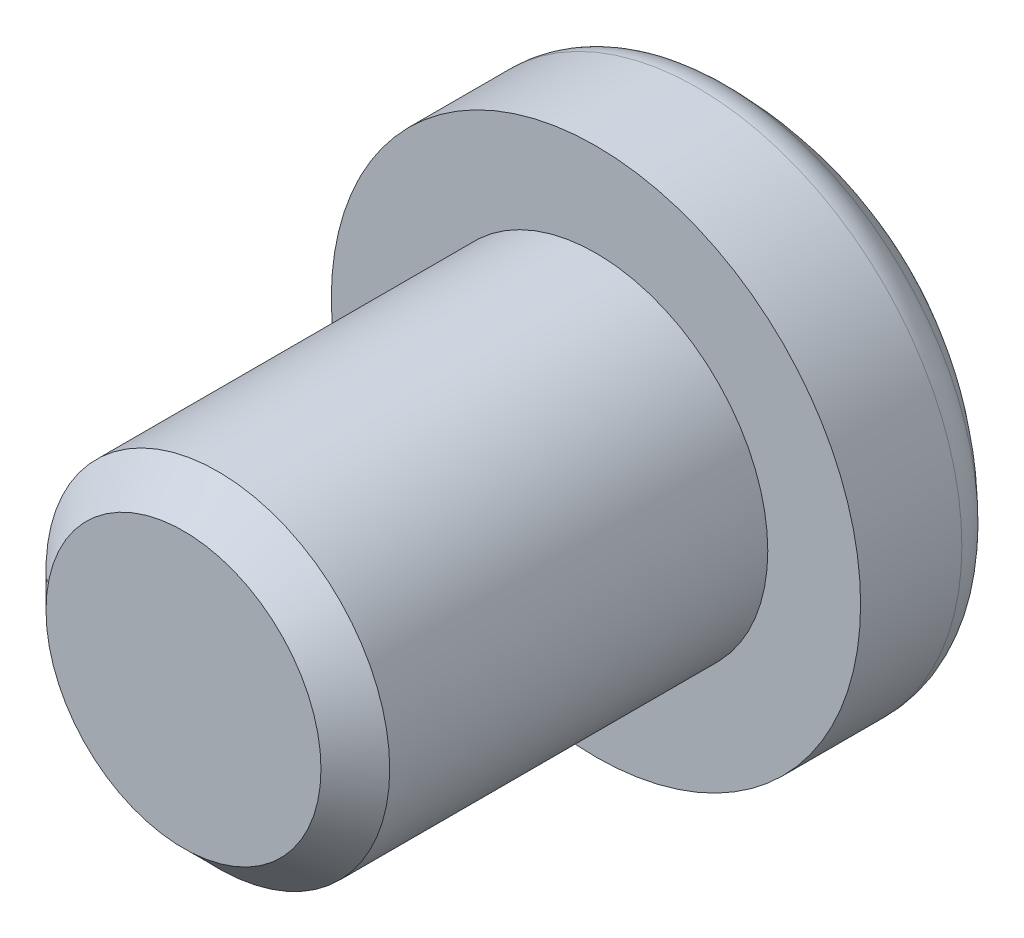
ISO-10303-21;
HEADER;
FILE_DESCRIPTION(('STEP AP214'),'2;1');
FILE_NAME('part.step','',(''),(''),'','','');
FILE_SCHEMA(('AUTOMOTIVE_DESIGN { 1 0 10303 214 1 1 1 1 }'));
ENDSEC;
DATA;
#1=APPLICATION_CONTEXT('core data for automotive mechanical design processes');
#2=APPLICATION_PROTOCOL_DEFINITION('international standard','automotive_design',2000,#1);
#3=PRODUCT_CONTEXT('',#1,'mechanical');
#4=PRODUCT('Part','Part','',(#3));
#5=PRODUCT_RELATED_PRODUCT_CATEGORY('part','',(#4));
#6=PRODUCT_DEFINITION_FORMATION('','',#4);
#7=PRODUCT_DEFINITION_CONTEXT('part definition',#1,'design');
#8=PRODUCT_DEFINITION('design','',#6,#7);
#9=PRODUCT_DEFINITION_SHAPE('','',#8);
#10=(LENGTH_UNIT() NAMED_UNIT(*) SI_UNIT(.MILLI.,.METRE.));
#11=(NAMED_UNIT(*) PLANE_ANGLE_UNIT() SI_UNIT($,.RADIAN.));
#12=(NAMED_UNIT(*) SI_UNIT($,.STERADIAN.) SOLID_ANGLE_UNIT());
#13=UNCERTAINTY_MEASURE_WITH_UNIT(LENGTH_MEASURE(1.E-05),#10,'distance_accuracy_value','');
#14=(GEOMETRIC_REPRESENTATION_CONTEXT(3) GLOBAL_UNCERTAINTY_ASSIGNED_CONTEXT((#13)) GLOBAL_UNIT_ASSIGNED_CONTEXT((#10,
#11,#12)) REPRESENTATION_CONTEXT('',''));
#15=CARTESIAN_POINT('',(0.,0.,0.));
#16=DIRECTION('',(0.,0.,1.));
#17=DIRECTION('',(1.,0.,0.));
#18=AXIS2_PLACEMENT_3D('',#15,#16,#17);
#19=CARTESIAN_POINT('',(0.,0.,1.80955882352941));
#20=DIRECTION('',(0.,0.,-1.));
#21=DIRECTION('',(1.,0.,0.));
#22=AXIS2_PLACEMENT_3D('',#19,#20,#21);
#23=SPHERICAL_SURFACE('',#22,5.20955882352941);
#24=CARTESIAN_POINT('',(0.,0.,-1.87380453128501));
#25=DIRECTION('',(0.,0.,-1.));
#26=DIRECTION('',(-1.,0.,0.));
#27=AXIS2_PLACEMENT_3D('',#24,#25,#26);
#28=CIRCLE('',#27,3.68406535395661);
#29=CARTESIAN_POINT('',(-3.68406535395661,0.,-1.87380453128501));
#30=VERTEX_POINT('',#29);
#31=EDGE_CURVE('E211',#30,#30,#28,.T.);
#32=ORIENTED_EDGE('',*,*,#31,.T.);
#33=EDGE_LOOP('',(#32));
#34=FACE_BOUND('',#33,.T.);
#35=CARTESIAN_POINT('',(-2.35,0.,1.80955882352941));
#36=DIRECTION('',(1.,0.,0.));
#37=DIRECTION('',(0.,0.,-1.));
#38=AXIS2_PLACEMENT_3D('',#35,#36,#37);
#39=CIRCLE('',#38,4.64940890176516);
#40=CARTESIAN_POINT('',(-2.35,-0.6,-2.80097293927335));
#41=VERTEX_POINT('',#40);
#42=CARTESIAN_POINT('',(-2.35,0.6,-2.80097293927335));
#43=VERTEX_POINT('',#42);
#44=EDGE_CURVE('E235',#41,#43,#39,.T.);
#45=ORIENTED_EDGE('',*,*,#44,.F.);
#46=CARTESIAN_POINT('',(0.,-0.6,1.80955882352941));
#47=DIRECTION('',(0.,1.,0.));
#48=DIRECTION('',(-1.,0.,0.));
#49=AXIS2_PLACEMENT_3D('',#46,#47,#48);
#50=CIRCLE('',#49,5.17489160618975);
#51=CARTESIAN_POINT('',(-0.6,-0.6,-3.33043175387568));
#52=VERTEX_POINT('',#51);
#53=EDGE_CURVE('E60',#52,#41,#50,.T.);
#54=ORIENTED_EDGE('',*,*,#53,.F.);
#55=CARTESIAN_POINT('',(-0.6,0.,1.80955882352941));
#56=DIRECTION('',(1.,0.,0.));
#57=DIRECTION('',(0.,1.,0.));
#58=AXIS2_PLACEMENT_3D('',#55,#56,#57);
#59=CIRCLE('',#58,5.17489160618975);
#60=CARTESIAN_POINT('',(-0.6,-2.35,-2.80097293927335));
#61=VERTEX_POINT('',#60);
#62=EDGE_CURVE('E232',#61,#52,#59,.T.);
#63=ORIENTED_EDGE('',*,*,#62,.F.);
#64=CARTESIAN_POINT('',(0.,-2.35,1.80955882352941));
#65=DIRECTION('',(0.,1.,0.));
#66=DIRECTION('',(0.,0.,1.));
#67=AXIS2_PLACEMENT_3D('',#64,#65,#66);
#68=CIRCLE('',#67,4.64940890176516);
#69=CARTESIAN_POINT('',(0.6,-2.35,-2.80097293927335));
#70=VERTEX_POINT('',#69);
#71=EDGE_CURVE('E230',#70,#61,#68,.T.);
#72=ORIENTED_EDGE('',*,*,#71,.F.);
#73=CARTESIAN_POINT('',(0.6,0.,1.80955882352941));
#74=DIRECTION('',(-1.,0.,0.));
#75=DIRECTION('',(0.,-1.,0.));
#76=AXIS2_PLACEMENT_3D('',#73,#74,#75);
#77=CIRCLE('',#76,5.17489160618975);
#78=CARTESIAN_POINT('',(0.6,-0.6,-3.33043175387568));
#79=VERTEX_POINT('',#78);
#80=EDGE_CURVE('E228',#79,#70,#77,.T.);
#81=ORIENTED_EDGE('',*,*,#80,.F.);
#82=CARTESIAN_POINT('',(0.,-0.6,1.80955882352941));
#83=DIRECTION('',(0.,1.,0.));
#84=DIRECTION('',(-1.,0.,0.));
#85=AXIS2_PLACEMENT_3D('',#82,#83,#84);
#86=CIRCLE('',#85,5.17489160618975);
#87=CARTESIAN_POINT('',(2.35,-0.6,-2.80097293927335));
#88=VERTEX_POINT('',#87);
#89=EDGE_CURVE('E226',#88,#79,#86,.T.);
#90=ORIENTED_EDGE('',*,*,#89,.F.);
#91=CARTESIAN_POINT('',(2.35,0.,1.80955882352941));
#92=DIRECTION('',(-1.,0.,0.));
#93=DIRECTION('',(0.,-1.,0.));
#94=AXIS2_PLACEMENT_3D('',#91,#92,#93);
#95=CIRCLE('',#94,4.64940890176516);
#96=CARTESIAN_POINT('',(2.35,0.6,-2.80097293927335));
#97=VERTEX_POINT('',#96);
#98=EDGE_CURVE('E224',#97,#88,#95,.T.);
#99=ORIENTED_EDGE('',*,*,#98,.F.);
#100=CARTESIAN_POINT('',(0.,0.6,1.80955882352941));
#101=DIRECTION('',(0.,-1.,0.));
#102=DIRECTION('',(1.,0.,0.));
#103=AXIS2_PLACEMENT_3D('',#100,#101,#102);
#104=CIRCLE('',#103,5.17489160618975);
#105=CARTESIAN_POINT('',(0.6,0.6,-3.33043175387568));
#106=VERTEX_POINT('',#105);
#107=EDGE_CURVE('E222',#106,#97,#104,.T.);
#108=ORIENTED_EDGE('',*,*,#107,.F.);
#109=CARTESIAN_POINT('',(0.6,0.,1.80955882352941));
#110=DIRECTION('',(-1.,0.,0.));
#111=DIRECTION('',(0.,-1.,0.));
#112=AXIS2_PLACEMENT_3D('',#109,#110,#111);
#113=CIRCLE('',#112,5.17489160618975);
#114=CARTESIAN_POINT('',(0.6,2.35,-2.80097293927335));
#115=VERTEX_POINT('',#114);
#116=EDGE_CURVE('E220',#115,#106,#113,.T.);
#117=ORIENTED_EDGE('',*,*,#116,.F.);
#118=CARTESIAN_POINT('',(0.,2.35,1.80955882352941));
#119=DIRECTION('',(0.,-1.,0.));
#120=DIRECTION('',(0.,0.,-1.));
#121=AXIS2_PLACEMENT_3D('',#118,#119,#120);
#122=CIRCLE('',#121,4.64940890176516);
#123=CARTESIAN_POINT('',(-0.6,2.35,-2.80097293927335));
#124=VERTEX_POINT('',#123);
#125=EDGE_CURVE('E218',#124,#115,#122,.T.);
#126=ORIENTED_EDGE('',*,*,#125,.F.);
#127=CARTESIAN_POINT('',(-0.6,0.,1.80955882352941));
#128=DIRECTION('',(1.,0.,0.));
#129=DIRECTION('',(0.,1.,0.));
#130=AXIS2_PLACEMENT_3D('',#127,#128,#129);
#131=CIRCLE('',#130,5.17489160618975);
#132=CARTESIAN_POINT('',(-0.6,0.6,-3.33043175387568));
#133=VERTEX_POINT('',#132);
#134=EDGE_CURVE('E216',#133,#124,#131,.T.);
#135=ORIENTED_EDGE('',*,*,#134,.F.);
#136=CARTESIAN_POINT('',(0.,0.6,1.80955882352941));
#137=DIRECTION('',(0.,-1.,0.));
#138=DIRECTION('',(1.,0.,0.));
#139=AXIS2_PLACEMENT_3D('',#136,#137,#138);
#140=CIRCLE('',#139,5.17489160618975);
#141=EDGE_CURVE('E214',#43,#133,#140,.T.);
#142=ORIENTED_EDGE('',*,*,#141,.F.);
#143=EDGE_LOOP('',(#45,#54,#63,#72,#81,#90,#99,#108,#117,#126,#135,#142));
#144=FACE_BOUND('',#143,.T.);
#145=ADVANCED_FACE('F37',(#34,#144),#23,.T.);
#146=CARTESIAN_POINT('',(0.,0.,-1.47314887020145));
#147=DIRECTION('',(0.,0.,-1.));
#148=DIRECTION('',(-1.,0.,0.));
#149=AXIS2_PLACEMENT_3D('',#146,#147,#148);
#150=TOROIDAL_SURFACE('',#149,3.28333333333333,0.566666666666667);
#151=ORIENTED_EDGE('',*,*,#31,.F.);
#152=EDGE_LOOP('',(#151));
#153=FACE_BOUND('',#152,.T.);
#154=CARTESIAN_POINT('',(0.,0.,-1.47314887020145));
#155=DIRECTION('',(0.,0.,-1.));
#156=DIRECTION('',(-1.,0.,0.));
#157=AXIS2_PLACEMENT_3D('',#154,#155,#156);
#158=CIRCLE('',#157,3.85);
#159=CARTESIAN_POINT('',(-3.85,0.,-1.47314887020145));
#160=VERTEX_POINT('',#159);
#161=EDGE_CURVE('E208',#160,#160,#158,.T.);
#162=ORIENTED_EDGE('',*,*,#161,.T.);
#163=EDGE_LOOP('',(#162));
#164=FACE_BOUND('',#163,.T.);
#165=ADVANCED_FACE('F253',(#153,#164),#150,.T.);
#166=CARTESIAN_POINT('',(0.,0.,0.));
#167=DIRECTION('',(0.,0.,-1.));
#168=DIRECTION('',(-1.,0.,0.));
#169=AXIS2_PLACEMENT_3D('',#166,#167,#168);
#170=CYLINDRICAL_SURFACE('',#169,3.85);
#171=ORIENTED_EDGE('',*,*,#161,.F.);
#172=EDGE_LOOP('',(#171));
#173=FACE_BOUND('',#172,.T.);
#174=CARTESIAN_POINT('',(0.,0.,0.));
#175=DIRECTION('',(0.,0.,-1.));
#176=DIRECTION('',(-1.,0.,0.));
#177=AXIS2_PLACEMENT_3D('',#174,#175,#176);
#178=CIRCLE('',#177,3.85);
#179=CARTESIAN_POINT('',(-3.85,0.,0.));
#180=VERTEX_POINT('',#179);
#181=EDGE_CURVE('E133',#180,#180,#178,.T.);
#182=ORIENTED_EDGE('',*,*,#181,.T.);
#183=EDGE_LOOP('',(#182));
#184=FACE_BOUND('',#183,.T.);
#185=ADVANCED_FACE('F258',(#173,#184),#170,.T.);
#186=CARTESIAN_POINT('',(0.,0.,0.));
#187=DIRECTION('',(0.,0.,-1.));
#188=DIRECTION('',(-1.,0.,0.));
#189=AXIS2_PLACEMENT_3D('',#186,#187,#188);
#190=PLANE('',#189);
#191=CARTESIAN_POINT('',(0.,0.,0.));
#192=DIRECTION('',(0.,0.,1.));
#193=DIRECTION('',(1.,0.,0.));
#194=AXIS2_PLACEMENT_3D('',#191,#192,#193);
#195=CIRCLE('',#194,2.5);
#196=CARTESIAN_POINT('',(2.5,0.,0.));
#197=VERTEX_POINT('',#196);
#198=EDGE_CURVE('E174',#197,#197,#195,.T.);
#199=ORIENTED_EDGE('',*,*,#198,.F.);
#200=EDGE_LOOP('',(#199));
#201=FACE_BOUND('',#200,.T.);
#202=ORIENTED_EDGE('',*,*,#181,.F.);
#203=EDGE_LOOP('',(#202));
#204=FACE_BOUND('',#203,.T.);
#205=ADVANCED_FACE('F265',(#201,#204),#190,.F.);
#206=CARTESIAN_POINT('',(-2.35,0.6,-2.2));
#207=DIRECTION('',(1.,0.,0.));
#208=DIRECTION('',(0.,0.,-1.));
#209=AXIS2_PLACEMENT_3D('',#206,#207,#208);
#210=PLANE('',#209);
#211=ORIENTED_EDGE('',*,*,#44,.T.);
#212=DIRECTION('',(0.,0.,-1.));
#213=VECTOR('',#212,1.);
#214=CARTESIAN_POINT('',(-2.35,0.6,-2.2));
#215=LINE('',#214,#213);
#216=CARTESIAN_POINT('',(-2.35,0.6,-0.2));
#217=VERTEX_POINT('',#216);
#218=EDGE_CURVE('E52',#217,#43,#215,.T.);
#219=ORIENTED_EDGE('',*,*,#218,.F.);
#220=DIRECTION('',(0.,1.,0.));
#221=VECTOR('',#220,1.);
#222=CARTESIAN_POINT('',(-2.35,-0.6,-0.2));
#223=LINE('',#222,#221);
#224=CARTESIAN_POINT('',(-2.35,-0.6,-0.2));
#225=VERTEX_POINT('',#224);
#226=EDGE_CURVE('E137',#225,#217,#223,.T.);
#227=ORIENTED_EDGE('',*,*,#226,.F.);
#228=DIRECTION('',(0.,0.,-1.));
#229=VECTOR('',#228,1.);
#230=CARTESIAN_POINT('',(-2.35,-0.6,-2.2));
#231=LINE('',#230,#229);
#232=EDGE_CURVE('E125',#225,#41,#231,.T.);
#233=ORIENTED_EDGE('',*,*,#232,.T.);
#234=EDGE_LOOP('',(#211,#219,#227,#233));
#235=FACE_BOUND('',#234,.T.);
#236=ADVANCED_FACE('F138',(#235),#210,.T.);
#237=CARTESIAN_POINT('',(-2.35,-0.6,-2.2));
#238=DIRECTION('',(0.,1.,0.));
#239=DIRECTION('',(-1.,0.,0.));
#240=AXIS2_PLACEMENT_3D('',#237,#238,#239);
#241=PLANE('',#240);
#242=ORIENTED_EDGE('',*,*,#53,.T.);
#243=ORIENTED_EDGE('',*,*,#232,.F.);
#244=DIRECTION('',(-1.,0.,0.));
#245=VECTOR('',#244,1.);
#246=CARTESIAN_POINT('',(-0.6,-0.6,-0.2));
#247=LINE('',#246,#245);
#248=CARTESIAN_POINT('',(-0.6,-0.6,-0.2));
#249=VERTEX_POINT('',#248);
#250=EDGE_CURVE('E129',#249,#225,#247,.T.);
#251=ORIENTED_EDGE('',*,*,#250,.F.);
#252=DIRECTION('',(0.,0.,-1.));
#253=VECTOR('',#252,1.);
#254=CARTESIAN_POINT('',(-0.6,-0.6,-2.2));
#255=LINE('',#254,#253);
#256=EDGE_CURVE('E134',#249,#52,#255,.T.);
#257=ORIENTED_EDGE('',*,*,#256,.T.);
#258=EDGE_LOOP('',(#242,#243,#251,#257));
#259=FACE_BOUND('',#258,.T.);
#260=ADVANCED_FACE('F127',(#259),#241,.T.);
#261=CARTESIAN_POINT('',(-0.6,-0.6,-2.2));
#262=DIRECTION('',(1.,0.,0.));
#263=DIRECTION('',(0.,1.,0.));
#264=AXIS2_PLACEMENT_3D('',#261,#262,#263);
#265=PLANE('',#264);
#266=ORIENTED_EDGE('',*,*,#62,.T.);
#267=ORIENTED_EDGE('',*,*,#256,.F.);
#268=DIRECTION('',(0.,1.,0.));
#269=VECTOR('',#268,1.);
#270=CARTESIAN_POINT('',(-0.6,-2.35,-0.2));
#271=LINE('',#270,#269);
#272=CARTESIAN_POINT('',(-0.6,-2.35,-0.2));
#273=VERTEX_POINT('',#272);
#274=EDGE_CURVE('E146',#273,#249,#271,.T.);
#275=ORIENTED_EDGE('',*,*,#274,.F.);
#276=DIRECTION('',(0.,0.,-1.));
#277=VECTOR('',#276,1.);
#278=CARTESIAN_POINT('',(-0.6,-2.35,-2.2));
#279=LINE('',#278,#277);
#280=EDGE_CURVE('E202',#273,#61,#279,.T.);
#281=ORIENTED_EDGE('',*,*,#280,.T.);
#282=EDGE_LOOP('',(#266,#267,#275,#281));
#283=FACE_BOUND('',#282,.T.);
#284=ADVANCED_FACE('F274',(#283),#265,.T.);
#285=CARTESIAN_POINT('',(-0.6,-2.35,-2.2));
#286=DIRECTION('',(0.,1.,0.));
#287=DIRECTION('',(0.,0.,1.));
#288=AXIS2_PLACEMENT_3D('',#285,#286,#287);
#289=PLANE('',#288);
#290=ORIENTED_EDGE('',*,*,#71,.T.);
#291=ORIENTED_EDGE('',*,*,#280,.F.);
#292=DIRECTION('',(-1.,0.,0.));
#293=VECTOR('',#292,1.);
#294=CARTESIAN_POINT('',(0.6,-2.35,-0.2));
#295=LINE('',#294,#293);
#296=CARTESIAN_POINT('',(0.6,-2.35,-0.2));
#297=VERTEX_POINT('',#296);
#298=EDGE_CURVE('E171',#297,#273,#295,.T.);
#299=ORIENTED_EDGE('',*,*,#298,.F.);
#300=DIRECTION('',(0.,0.,-1.));
#301=VECTOR('',#300,1.);
#302=CARTESIAN_POINT('',(0.6,-2.35,-2.2));
#303=LINE('',#302,#301);
#304=EDGE_CURVE('E199',#297,#70,#303,.T.);
#305=ORIENTED_EDGE('',*,*,#304,.T.);
#306=EDGE_LOOP('',(#290,#291,#299,#305));
#307=FACE_BOUND('',#306,.T.);
#308=ADVANCED_FACE('F277',(#307),#289,.T.);
#309=CARTESIAN_POINT('',(0.6,-0.6,-2.2));
#310=DIRECTION('',(-1.,0.,0.));
#311=DIRECTION('',(0.,-1.,0.));
#312=AXIS2_PLACEMENT_3D('',#309,#310,#311);
#313=PLANE('',#312);
#314=ORIENTED_EDGE('',*,*,#80,.T.);
#315=ORIENTED_EDGE('',*,*,#304,.F.);
#316=DIRECTION('',(0.,-1.,0.));
#317=VECTOR('',#316,1.);
#318=CARTESIAN_POINT('',(0.6,-0.6,-0.2));
#319=LINE('',#318,#317);
#320=CARTESIAN_POINT('',(0.6,-0.6,-0.2));
#321=VERTEX_POINT('',#320);
#322=EDGE_CURVE('E168',#321,#297,#319,.T.);
#323=ORIENTED_EDGE('',*,*,#322,.F.);
#324=DIRECTION('',(0.,0.,-1.));
#325=VECTOR('',#324,1.);
#326=CARTESIAN_POINT('',(0.6,-0.6,-2.2));
#327=LINE('',#326,#325);
#328=EDGE_CURVE('E196',#321,#79,#327,.T.);
#329=ORIENTED_EDGE('',*,*,#328,.T.);
#330=EDGE_LOOP('',(#314,#315,#323,#329));
#331=FACE_BOUND('',#330,.T.);
#332=ADVANCED_FACE('F281',(#331),#313,.T.);
#333=CARTESIAN_POINT('',(0.6,-0.6,-2.2));
#334=DIRECTION('',(0.,1.,0.));
#335=DIRECTION('',(-1.,0.,0.));
#336=AXIS2_PLACEMENT_3D('',#333,#334,#335);
#337=PLANE('',#336);
#338=ORIENTED_EDGE('',*,*,#89,.T.);
#339=ORIENTED_EDGE('',*,*,#328,.F.);
#340=DIRECTION('',(-1.,0.,0.));
#341=VECTOR('',#340,1.);
#342=CARTESIAN_POINT('',(2.35,-0.6,-0.2));
#343=LINE('',#342,#341);
#344=CARTESIAN_POINT('',(2.35,-0.6,-0.2));
#345=VERTEX_POINT('',#344);
#346=EDGE_CURVE('E165',#345,#321,#343,.T.);
#347=ORIENTED_EDGE('',*,*,#346,.F.);
#348=DIRECTION('',(0.,0.,-1.));
#349=VECTOR('',#348,1.);
#350=CARTESIAN_POINT('',(2.35,-0.6,-2.2));
#351=LINE('',#350,#349);
#352=EDGE_CURVE('E193',#345,#88,#351,.T.);
#353=ORIENTED_EDGE('',*,*,#352,.T.);
#354=EDGE_LOOP('',(#338,#339,#347,#353));
#355=FACE_BOUND('',#354,.T.);
#356=ADVANCED_FACE('F285',(#355),#337,.T.);
#357=CARTESIAN_POINT('',(2.35,0.6,-2.2));
#358=DIRECTION('',(-1.,0.,0.));
#359=DIRECTION('',(0.,-1.,0.));
#360=AXIS2_PLACEMENT_3D('',#357,#358,#359);
#361=PLANE('',#360);
#362=ORIENTED_EDGE('',*,*,#98,.T.);
#363=ORIENTED_EDGE('',*,*,#352,.F.);
#364=DIRECTION('',(0.,-1.,0.));
#365=VECTOR('',#364,1.);
#366=CARTESIAN_POINT('',(2.35,0.6,-0.2));
#367=LINE('',#366,#365);
#368=CARTESIAN_POINT('',(2.35,0.6,-0.2));
#369=VERTEX_POINT('',#368);
#370=EDGE_CURVE('E162',#369,#345,#367,.T.);
#371=ORIENTED_EDGE('',*,*,#370,.F.);
#372=DIRECTION('',(0.,0.,-1.));
#373=VECTOR('',#372,1.);
#374=CARTESIAN_POINT('',(2.35,0.6,-2.2));
#375=LINE('',#374,#373);
#376=EDGE_CURVE('E190',#369,#97,#375,.T.);
#377=ORIENTED_EDGE('',*,*,#376,.T.);
#378=EDGE_LOOP('',(#362,#363,#371,#377));
#379=FACE_BOUND('',#378,.T.);
#380=ADVANCED_FACE('F289',(#379),#361,.T.);
#381=CARTESIAN_POINT('',(0.6,0.6,-2.2));
#382=DIRECTION('',(0.,-1.,0.));
#383=DIRECTION('',(1.,0.,0.));
#384=AXIS2_PLACEMENT_3D('',#381,#382,#383);
#385=PLANE('',#384);
#386=ORIENTED_EDGE('',*,*,#107,.T.);
#387=ORIENTED_EDGE('',*,*,#376,.F.);
#388=DIRECTION('',(1.,0.,0.));
#389=VECTOR('',#388,1.);
#390=CARTESIAN_POINT('',(0.6,0.6,-0.2));
#391=LINE('',#390,#389);
#392=CARTESIAN_POINT('',(0.6,0.6,-0.2));
#393=VERTEX_POINT('',#392);
#394=EDGE_CURVE('E159',#393,#369,#391,.T.);
#395=ORIENTED_EDGE('',*,*,#394,.F.);
#396=DIRECTION('',(0.,0.,-1.));
#397=VECTOR('',#396,1.);
#398=CARTESIAN_POINT('',(0.6,0.6,-2.2));
#399=LINE('',#398,#397);
#400=EDGE_CURVE('E187',#393,#106,#399,.T.);
#401=ORIENTED_EDGE('',*,*,#400,.T.);
#402=EDGE_LOOP('',(#386,#387,#395,#401));
#403=FACE_BOUND('',#402,.T.);
#404=ADVANCED_FACE('F293',(#403),#385,.T.);
#405=CARTESIAN_POINT('',(0.6,2.35,-2.2));
#406=DIRECTION('',(-1.,0.,0.));
#407=DIRECTION('',(0.,-1.,0.));
#408=AXIS2_PLACEMENT_3D('',#405,#406,#407);
#409=PLANE('',#408);
#410=ORIENTED_EDGE('',*,*,#116,.T.);
#411=ORIENTED_EDGE('',*,*,#400,.F.);
#412=DIRECTION('',(0.,-1.,0.));
#413=VECTOR('',#412,1.);
#414=CARTESIAN_POINT('',(0.6,2.35,-0.2));
#415=LINE('',#414,#413);
#416=CARTESIAN_POINT('',(0.6,2.35,-0.2));
#417=VERTEX_POINT('',#416);
#418=EDGE_CURVE('E156',#417,#393,#415,.T.);
#419=ORIENTED_EDGE('',*,*,#418,.F.);
#420=DIRECTION('',(0.,0.,-1.));
#421=VECTOR('',#420,1.);
#422=CARTESIAN_POINT('',(0.6,2.35,-2.2));
#423=LINE('',#422,#421);
#424=EDGE_CURVE('E184',#417,#115,#423,.T.);
#425=ORIENTED_EDGE('',*,*,#424,.T.);
#426=EDGE_LOOP('',(#410,#411,#419,#425));
#427=FACE_BOUND('',#426,.T.);
#428=ADVANCED_FACE('F297',(#427),#409,.T.);
#429=CARTESIAN_POINT('',(-0.6,2.35,-2.2));
#430=DIRECTION('',(0.,-1.,0.));
#431=DIRECTION('',(0.,0.,-1.));
#432=AXIS2_PLACEMENT_3D('',#429,#430,#431);
#433=PLANE('',#432);
#434=ORIENTED_EDGE('',*,*,#125,.T.);
#435=ORIENTED_EDGE('',*,*,#424,.F.);
#436=DIRECTION('',(1.,0.,0.));
#437=VECTOR('',#436,1.);
#438=CARTESIAN_POINT('',(-0.6,2.35,-0.2));
#439=LINE('',#438,#437);
#440=CARTESIAN_POINT('',(-0.6,2.35,-0.2));
#441=VERTEX_POINT('',#440);
#442=EDGE_CURVE('E153',#441,#417,#439,.T.);
#443=ORIENTED_EDGE('',*,*,#442,.F.);
#444=DIRECTION('',(0.,0.,-1.));
#445=VECTOR('',#444,1.);
#446=CARTESIAN_POINT('',(-0.6,2.35,-2.2));
#447=LINE('',#446,#445);
#448=EDGE_CURVE('E181',#441,#124,#447,.T.);
#449=ORIENTED_EDGE('',*,*,#448,.T.);
#450=EDGE_LOOP('',(#434,#435,#443,#449));
#451=FACE_BOUND('',#450,.T.);
#452=ADVANCED_FACE('F301',(#451),#433,.T.);
#453=CARTESIAN_POINT('',(-0.6,2.35,-2.2));
#454=DIRECTION('',(1.,0.,0.));
#455=DIRECTION('',(0.,1.,0.));
#456=AXIS2_PLACEMENT_3D('',#453,#454,#455);
#457=PLANE('',#456);
#458=ORIENTED_EDGE('',*,*,#134,.T.);
#459=ORIENTED_EDGE('',*,*,#448,.F.);
#460=DIRECTION('',(0.,1.,0.));
#461=VECTOR('',#460,1.);
#462=CARTESIAN_POINT('',(-0.6,0.6,-0.2));
#463=LINE('',#462,#461);
#464=CARTESIAN_POINT('',(-0.6,0.6,-0.2));
#465=VERTEX_POINT('',#464);
#466=EDGE_CURVE('E150',#465,#441,#463,.T.);
#467=ORIENTED_EDGE('',*,*,#466,.F.);
#468=DIRECTION('',(0.,0.,-1.));
#469=VECTOR('',#468,1.);
#470=CARTESIAN_POINT('',(-0.6,0.6,-2.2));
#471=LINE('',#470,#469);
#472=EDGE_CURVE('E178',#465,#133,#471,.T.);
#473=ORIENTED_EDGE('',*,*,#472,.T.);
#474=EDGE_LOOP('',(#458,#459,#467,#473));
#475=FACE_BOUND('',#474,.T.);
#476=ADVANCED_FACE('F305',(#475),#457,.T.);
#477=CARTESIAN_POINT('',(-2.35,0.6,-2.2));
#478=DIRECTION('',(0.,-1.,0.));
#479=DIRECTION('',(1.,0.,0.));
#480=AXIS2_PLACEMENT_3D('',#477,#478,#479);
#481=PLANE('',#480);
#482=ORIENTED_EDGE('',*,*,#141,.T.);
#483=ORIENTED_EDGE('',*,*,#472,.F.);
#484=DIRECTION('',(1.,0.,0.));
#485=VECTOR('',#484,1.);
#486=CARTESIAN_POINT('',(-2.35,0.6,-0.2));
#487=LINE('',#486,#485);
#488=EDGE_CURVE('E141',#217,#465,#487,.T.);
#489=ORIENTED_EDGE('',*,*,#488,.F.);
#490=ORIENTED_EDGE('',*,*,#218,.T.);
#491=EDGE_LOOP('',(#482,#483,#489,#490));
#492=FACE_BOUND('',#491,.T.);
#493=ADVANCED_FACE('F309',(#492),#481,.T.);
#494=CARTESIAN_POINT('',(0.,0.,6.));
#495=DIRECTION('',(0.,0.,1.));
#496=DIRECTION('',(1.,0.,0.));
#497=AXIS2_PLACEMENT_3D('',#494,#495,#496);
#498=PLANE('',#497);
#499=CARTESIAN_POINT('',(0.,0.,6.));
#500=DIRECTION('',(0.,0.,1.));
#501=DIRECTION('',(1.,0.,0.));
#502=AXIS2_PLACEMENT_3D('',#499,#500,#501);
#503=CIRCLE('',#502,2.);
#504=CARTESIAN_POINT('',(2.,0.,6.));
#505=VERTEX_POINT('',#504);
#506=EDGE_CURVE('E45',#505,#505,#503,.T.);
#507=ORIENTED_EDGE('',*,*,#506,.T.);
#508=EDGE_LOOP('',(#507));
#509=FACE_BOUND('',#508,.T.);
#510=ADVANCED_FACE('F239',(#509),#498,.T.);
#511=CARTESIAN_POINT('',(0.,0.,0.));
#512=DIRECTION('',(0.,0.,1.));
#513=DIRECTION('',(1.,0.,0.));
#514=AXIS2_PLACEMENT_3D('',#511,#512,#513);
#515=CYLINDRICAL_SURFACE('',#514,2.5);
#516=CARTESIAN_POINT('',(0.,0.,5.5));
#517=DIRECTION('',(0.,0.,1.));
#518=DIRECTION('',(1.,0.,0.));
#519=AXIS2_PLACEMENT_3D('',#516,#517,#518);
#520=CIRCLE('',#519,2.5);
#521=CARTESIAN_POINT('',(2.5,0.,5.5));
#522=VERTEX_POINT('',#521);
#523=EDGE_CURVE('E11',#522,#522,#520,.F.);
#524=ORIENTED_EDGE('',*,*,#523,.T.);
#525=EDGE_LOOP('',(#524));
#526=FACE_BOUND('',#525,.T.);
#527=ORIENTED_EDGE('',*,*,#198,.T.);
#528=EDGE_LOOP('',(#527));
#529=FACE_BOUND('',#528,.T.);
#530=ADVANCED_FACE('F242',(#526,#529),#515,.T.);
#531=CARTESIAN_POINT('',(0.,0.,6.));
#532=DIRECTION('',(0.,0.,-1.));
#533=DIRECTION('',(-1.,0.,0.));
#534=AXIS2_PLACEMENT_3D('',#531,#532,#533);
#535=CONICAL_SURFACE('',#534,2.,0.785398163397447);
#536=ORIENTED_EDGE('',*,*,#523,.F.);
#537=EDGE_LOOP('',(#536));
#538=FACE_BOUND('',#537,.T.);
#539=ORIENTED_EDGE('',*,*,#506,.F.);
#540=EDGE_LOOP('',(#539));
#541=FACE_BOUND('',#540,.T.);
#542=ADVANCED_FACE('F39',(#538,#541),#535,.T.);
#543=CARTESIAN_POINT('',(0.6,-0.6,-0.2));
#544=DIRECTION('',(0.,0.,1.));
#545=DIRECTION('',(1.,0.,0.));
#546=AXIS2_PLACEMENT_3D('',#543,#544,#545);
#547=PLANE('',#546);
#548=ORIENTED_EDGE('',*,*,#250,.T.);
#549=ORIENTED_EDGE('',*,*,#226,.T.);
#550=ORIENTED_EDGE('',*,*,#488,.T.);
#551=ORIENTED_EDGE('',*,*,#466,.T.);
#552=ORIENTED_EDGE('',*,*,#442,.T.);
#553=ORIENTED_EDGE('',*,*,#418,.T.);
#554=ORIENTED_EDGE('',*,*,#394,.T.);
#555=ORIENTED_EDGE('',*,*,#370,.T.);
#556=ORIENTED_EDGE('',*,*,#346,.T.);
#557=ORIENTED_EDGE('',*,*,#322,.T.);
#558=ORIENTED_EDGE('',*,*,#298,.T.);
#559=ORIENTED_EDGE('',*,*,#274,.T.);
#560=EDGE_LOOP('',(#548,#549,#550,#551,#552,#553,#554,#555,#556,#557,#558,#559));
#561=FACE_BOUND('',#560,.T.);
#562=ADVANCED_FACE('F143',(#561),#547,.F.);
#563=CLOSED_SHELL('',(#145,#165,#185,#205,#236,#260,#284,#308,#332,#356,#380,#404,#428,#452,
#476,#493,#510,#530,#542,#562));
#564=MANIFOLD_SOLID_BREP('B2',#563);
#565=ADVANCED_BREP_SHAPE_REPRESENTATION('',(#18,#564),#14);
#566=SHAPE_DEFINITION_REPRESENTATION(#9,#565);
ENDSEC;
END-ISO-10303-21;
